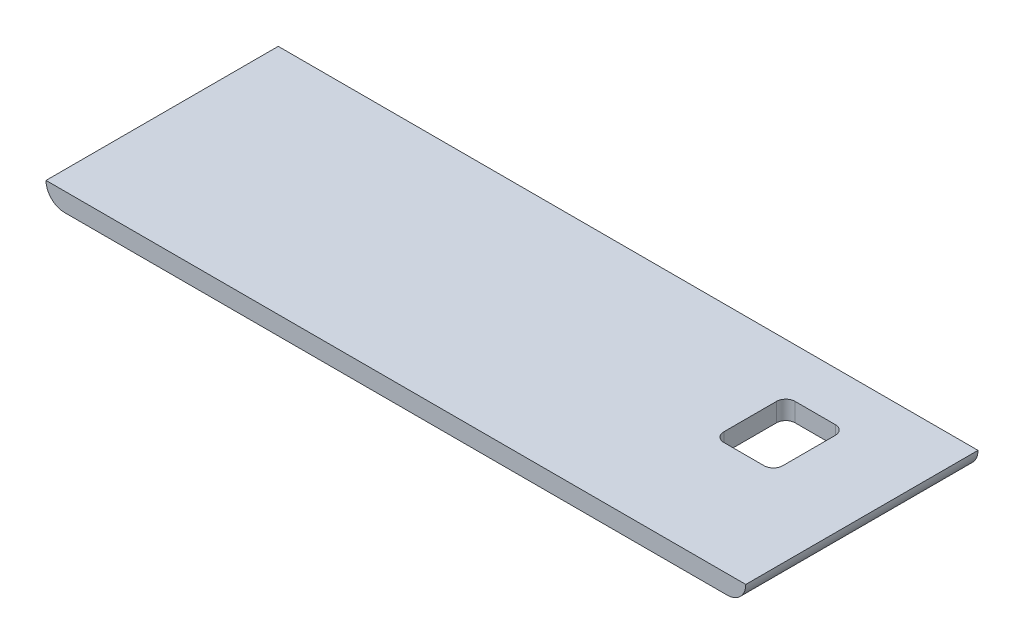
ISO-10303-21;
HEADER;
FILE_DESCRIPTION(('STEP AP214'),'2;1');
FILE_NAME('part.step','',(''),(''),'','','');
FILE_SCHEMA(('AUTOMOTIVE_DESIGN { 1 0 10303 214 1 1 1 1 }'));
ENDSEC;
DATA;
#1=APPLICATION_CONTEXT('core data for automotive mechanical design processes');
#2=APPLICATION_PROTOCOL_DEFINITION('international standard','automotive_design',2000,#1);
#3=PRODUCT_CONTEXT('',#1,'mechanical');
#4=PRODUCT('Part','Part','',(#3));
#5=PRODUCT_RELATED_PRODUCT_CATEGORY('part','',(#4));
#6=PRODUCT_DEFINITION_FORMATION('','',#4);
#7=PRODUCT_DEFINITION_CONTEXT('part definition',#1,'design');
#8=PRODUCT_DEFINITION('design','',#6,#7);
#9=PRODUCT_DEFINITION_SHAPE('','',#8);
#10=(LENGTH_UNIT() NAMED_UNIT(*) SI_UNIT(.MILLI.,.METRE.));
#11=(NAMED_UNIT(*) PLANE_ANGLE_UNIT() SI_UNIT($,.RADIAN.));
#12=(NAMED_UNIT(*) SI_UNIT($,.STERADIAN.) SOLID_ANGLE_UNIT());
#13=UNCERTAINTY_MEASURE_WITH_UNIT(LENGTH_MEASURE(1.E-05),#10,'distance_accuracy_value','');
#14=(GEOMETRIC_REPRESENTATION_CONTEXT(3) GLOBAL_UNCERTAINTY_ASSIGNED_CONTEXT((#13)) GLOBAL_UNIT_ASSIGNED_CONTEXT((#10,
#11,#12)) REPRESENTATION_CONTEXT('',''));
#15=CARTESIAN_POINT('',(0.,0.,0.));
#16=DIRECTION('',(0.,0.,1.));
#17=DIRECTION('',(1.,0.,0.));
#18=AXIS2_PLACEMENT_3D('',#15,#16,#17);
#19=CARTESIAN_POINT('',(115.,5.,1.5));
#20=DIRECTION('',(0.,-1.,0.));
#21=DIRECTION('',(0.,0.,-1.));
#22=AXIS2_PLACEMENT_3D('',#19,#20,#21);
#23=PLANE('',#22);
#24=DIRECTION('',(-1.,0.,0.));
#25=VECTOR('',#24,1.);
#26=CARTESIAN_POINT('',(103.4415158923,5.,9.421121748422));
#27=LINE('',#26,#25);
#28=CARTESIAN_POINT('',(99.883031784609,5.,9.421121748422));
#29=VERTEX_POINT('',#28);
#30=CARTESIAN_POINT('',(93.383031784609,5.,9.421121748422));
#31=VERTEX_POINT('',#30);
#32=EDGE_CURVE('E264',#29,#31,#27,.T.);
#33=ORIENTED_EDGE('',*,*,#32,.F.);
#34=CARTESIAN_POINT('',(99.883031784609,5.,10.921121748422));
#35=DIRECTION('',(0.,1.,0.));
#36=DIRECTION('',(1.,0.,0.));
#37=AXIS2_PLACEMENT_3D('',#34,#35,#36);
#38=CIRCLE('',#37,1.5);
#39=CARTESIAN_POINT('',(101.3830317846,5.,10.921121748422));
#40=VERTEX_POINT('',#39);
#41=EDGE_CURVE('E209',#40,#29,#38,.T.);
#42=ORIENTED_EDGE('',*,*,#41,.F.);
#43=DIRECTION('',(0.,0.,1.));
#44=VECTOR('',#43,1.);
#45=CARTESIAN_POINT('',(101.3830317846,5.,5.460560874211));
#46=LINE('',#45,#44);
#47=CARTESIAN_POINT('',(101.3830317846,5.,19.421121748422));
#48=VERTEX_POINT('',#47);
#49=EDGE_CURVE('E210',#40,#48,#46,.T.);
#50=ORIENTED_EDGE('',*,*,#49,.T.);
#51=CARTESIAN_POINT('',(99.883031784609,5.,19.421121748422));
#52=DIRECTION('',(0.,1.,0.));
#53=DIRECTION('',(1.,0.,0.));
#54=AXIS2_PLACEMENT_3D('',#51,#52,#53);
#55=CIRCLE('',#54,1.5);
#56=CARTESIAN_POINT('',(99.883031784609,5.,20.921121748422));
#57=VERTEX_POINT('',#56);
#58=EDGE_CURVE('E252',#57,#48,#55,.T.);
#59=ORIENTED_EDGE('',*,*,#58,.F.);
#60=DIRECTION('',(-1.,0.,0.));
#61=VECTOR('',#60,1.);
#62=CARTESIAN_POINT('',(103.4415158923,5.,20.921121748422));
#63=LINE('',#62,#61);
#64=CARTESIAN_POINT('',(93.383031784609,5.,20.921121748422));
#65=VERTEX_POINT('',#64);
#66=EDGE_CURVE('E245',#57,#65,#63,.T.);
#67=ORIENTED_EDGE('',*,*,#66,.T.);
#68=CARTESIAN_POINT('',(93.383031784609,5.,19.421121748422));
#69=DIRECTION('',(0.,1.,0.));
#70=DIRECTION('',(-1.,0.,0.));
#71=AXIS2_PLACEMENT_3D('',#68,#69,#70);
#72=CIRCLE('',#71,1.5);
#73=CARTESIAN_POINT('',(91.883031784609,5.,19.421121748422));
#74=VERTEX_POINT('',#73);
#75=EDGE_CURVE('E223',#74,#65,#72,.T.);
#76=ORIENTED_EDGE('',*,*,#75,.F.);
#77=DIRECTION('',(0.,0.,1.));
#78=VECTOR('',#77,1.);
#79=CARTESIAN_POINT('',(91.883031784609,5.,5.460560874211));
#80=LINE('',#79,#78);
#81=CARTESIAN_POINT('',(91.883031784609,5.,10.921121748422));
#82=VERTEX_POINT('',#81);
#83=EDGE_CURVE('E9',#82,#74,#80,.T.);
#84=ORIENTED_EDGE('',*,*,#83,.F.);
#85=CARTESIAN_POINT('',(93.383031784609,5.,10.921121748422));
#86=DIRECTION('',(0.,1.,0.));
#87=DIRECTION('',(-1.,0.,0.));
#88=AXIS2_PLACEMENT_3D('',#85,#86,#87);
#89=CIRCLE('',#88,1.5);
#90=EDGE_CURVE('E25',#31,#82,#89,.T.);
#91=ORIENTED_EDGE('',*,*,#90,.F.);
#92=EDGE_LOOP('',(#33,#42,#50,#59,#67,#76,#84,#91));
#93=FACE_BOUND('',#92,.T.);
#94=DIRECTION('',(-1.,0.,0.));
#95=VECTOR('',#94,1.);
#96=CARTESIAN_POINT('',(115.,5.,1.5));
#97=LINE('',#96,#95);
#98=CARTESIAN_POINT('',(115.,5.,1.5));
#99=VERTEX_POINT('',#98);
#100=CARTESIAN_POINT('',(2.,5.,1.5));
#101=VERTEX_POINT('',#100);
#102=EDGE_CURVE('E185',#99,#101,#97,.T.);
#103=ORIENTED_EDGE('',*,*,#102,.T.);
#104=DIRECTION('',(0.,0.,1.));
#105=VECTOR('',#104,1.);
#106=CARTESIAN_POINT('',(2.,5.,1.5));
#107=LINE('',#106,#105);
#108=CARTESIAN_POINT('',(2.,5.,39.));
#109=VERTEX_POINT('',#108);
#110=EDGE_CURVE('E140',#101,#109,#107,.T.);
#111=ORIENTED_EDGE('',*,*,#110,.T.);
#112=DIRECTION('',(-1.,0.,0.));
#113=VECTOR('',#112,1.);
#114=CARTESIAN_POINT('',(115.,5.,39.));
#115=LINE('',#114,#113);
#116=CARTESIAN_POINT('',(115.,5.,39.));
#117=VERTEX_POINT('',#116);
#118=EDGE_CURVE('E217',#117,#109,#115,.T.);
#119=ORIENTED_EDGE('',*,*,#118,.F.);
#120=DIRECTION('',(0.,0.,1.));
#121=VECTOR('',#120,1.);
#122=CARTESIAN_POINT('',(115.,5.,1.5));
#123=LINE('',#122,#121);
#124=EDGE_CURVE('E220',#99,#117,#123,.T.);
#125=ORIENTED_EDGE('',*,*,#124,.F.);
#126=EDGE_LOOP('',(#103,#111,#119,#125));
#127=FACE_BOUND('',#126,.T.);
#128=ADVANCED_FACE('F15',(#93,#127),#23,.F.);
#129=CARTESIAN_POINT('',(91.883031784609,1.,9.421121748422));
#130=DIRECTION('',(1.,0.,0.));
#131=DIRECTION('',(0.,1.,0.));
#132=AXIS2_PLACEMENT_3D('',#129,#130,#131);
#133=PLANE('',#132);
#134=DIRECTION('',(0.,0.,-1.));
#135=VECTOR('',#134,1.);
#136=CARTESIAN_POINT('',(91.883031784609,2.,5.460560874211));
#137=LINE('',#136,#135);
#138=CARTESIAN_POINT('',(91.883031784609,2.,19.421121748422));
#139=VERTEX_POINT('',#138);
#140=CARTESIAN_POINT('',(91.883031784609,2.,10.921121748422));
#141=VERTEX_POINT('',#140);
#142=EDGE_CURVE('E197',#139,#141,#137,.T.);
#143=ORIENTED_EDGE('',*,*,#142,.T.);
#144=DIRECTION('',(0.,1.,0.));
#145=VECTOR('',#144,1.);
#146=CARTESIAN_POINT('',(91.883031784609,1.,10.921121748422));
#147=LINE('',#146,#145);
#148=EDGE_CURVE('E230',#141,#82,#147,.T.);
#149=ORIENTED_EDGE('',*,*,#148,.T.);
#150=ORIENTED_EDGE('',*,*,#83,.T.);
#151=DIRECTION('',(0.,1.,0.));
#152=VECTOR('',#151,1.);
#153=CARTESIAN_POINT('',(91.883031784609,1.,19.421121748422));
#154=LINE('',#153,#152);
#155=EDGE_CURVE('E234',#139,#74,#154,.T.);
#156=ORIENTED_EDGE('',*,*,#155,.F.);
#157=EDGE_LOOP('',(#143,#149,#150,#156));
#158=FACE_BOUND('',#157,.T.);
#159=ADVANCED_FACE('F17',(#158),#133,.T.);
#160=CARTESIAN_POINT('',(93.383031784609,1.,10.921121748422));
#161=DIRECTION('',(0.,1.,0.));
#162=DIRECTION('',(-1.,0.,0.));
#163=AXIS2_PLACEMENT_3D('',#160,#161,#162);
#164=CYLINDRICAL_SURFACE('',#163,1.5);
#165=ORIENTED_EDGE('',*,*,#148,.F.);
#166=CARTESIAN_POINT('',(93.383031784609,2.,10.921121748422));
#167=DIRECTION('',(0.,1.,0.));
#168=DIRECTION('',(-1.,0.,0.));
#169=AXIS2_PLACEMENT_3D('',#166,#167,#168);
#170=CIRCLE('',#169,1.5);
#171=CARTESIAN_POINT('',(93.383031784609,2.,9.421121748422));
#172=VERTEX_POINT('',#171);
#173=EDGE_CURVE('E193',#172,#141,#170,.T.);
#174=ORIENTED_EDGE('',*,*,#173,.F.);
#175=DIRECTION('',(0.,1.,0.));
#176=VECTOR('',#175,1.);
#177=CARTESIAN_POINT('',(93.383031784609,1.,9.421121748422));
#178=LINE('',#177,#176);
#179=EDGE_CURVE('E19',#172,#31,#178,.T.);
#180=ORIENTED_EDGE('',*,*,#179,.T.);
#181=ORIENTED_EDGE('',*,*,#90,.T.);
#182=EDGE_LOOP('',(#165,#174,#180,#181));
#183=FACE_BOUND('',#182,.T.);
#184=ADVANCED_FACE('F274',(#183),#164,.F.);
#185=CARTESIAN_POINT('',(91.883031784609,1.,9.421121748422));
#186=DIRECTION('',(0.,0.,1.));
#187=DIRECTION('',(1.,0.,0.));
#188=AXIS2_PLACEMENT_3D('',#185,#186,#187);
#189=PLANE('',#188);
#190=ORIENTED_EDGE('',*,*,#32,.T.);
#191=ORIENTED_EDGE('',*,*,#179,.F.);
#192=DIRECTION('',(1.,0.,0.));
#193=VECTOR('',#192,1.);
#194=CARTESIAN_POINT('',(48.441515892304,2.,9.421121748422));
#195=LINE('',#194,#193);
#196=CARTESIAN_POINT('',(99.883031784609,2.,9.421121748422));
#197=VERTEX_POINT('',#196);
#198=EDGE_CURVE('E189',#172,#197,#195,.T.);
#199=ORIENTED_EDGE('',*,*,#198,.T.);
#200=DIRECTION('',(0.,1.,0.));
#201=VECTOR('',#200,1.);
#202=CARTESIAN_POINT('',(99.883031784609,1.,9.421121748422));
#203=LINE('',#202,#201);
#204=EDGE_CURVE('E261',#197,#29,#203,.T.);
#205=ORIENTED_EDGE('',*,*,#204,.T.);
#206=EDGE_LOOP('',(#190,#191,#199,#205));
#207=FACE_BOUND('',#206,.T.);
#208=ADVANCED_FACE('F276',(#207),#189,.T.);
#209=CARTESIAN_POINT('',(99.883031784609,1.,10.921121748422));
#210=DIRECTION('',(0.,1.,0.));
#211=DIRECTION('',(1.,0.,0.));
#212=AXIS2_PLACEMENT_3D('',#209,#210,#211);
#213=CYLINDRICAL_SURFACE('',#212,1.5);
#214=ORIENTED_EDGE('',*,*,#41,.T.);
#215=ORIENTED_EDGE('',*,*,#204,.F.);
#216=CARTESIAN_POINT('',(99.883031784609,2.,10.921121748422));
#217=DIRECTION('',(0.,1.,0.));
#218=DIRECTION('',(1.,0.,0.));
#219=AXIS2_PLACEMENT_3D('',#216,#217,#218);
#220=CIRCLE('',#219,1.5);
#221=CARTESIAN_POINT('',(101.3830317846,2.,10.921121748422));
#222=VERTEX_POINT('',#221);
#223=EDGE_CURVE('E182',#222,#197,#220,.T.);
#224=ORIENTED_EDGE('',*,*,#223,.F.);
#225=DIRECTION('',(0.,1.,0.));
#226=VECTOR('',#225,1.);
#227=CARTESIAN_POINT('',(101.3830317846,1.,10.921121748422));
#228=LINE('',#227,#226);
#229=EDGE_CURVE('E205',#222,#40,#228,.T.);
#230=ORIENTED_EDGE('',*,*,#229,.T.);
#231=EDGE_LOOP('',(#214,#215,#224,#230));
#232=FACE_BOUND('',#231,.T.);
#233=ADVANCED_FACE('F282',(#232),#213,.F.);
#234=CARTESIAN_POINT('',(101.3830317846,1.,9.421121748422));
#235=DIRECTION('',(1.,0.,0.));
#236=DIRECTION('',(0.,1.,0.));
#237=AXIS2_PLACEMENT_3D('',#234,#235,#236);
#238=PLANE('',#237);
#239=DIRECTION('',(0.,1.,0.));
#240=VECTOR('',#239,1.);
#241=CARTESIAN_POINT('',(101.3830317846,1.,19.421121748422));
#242=LINE('',#241,#240);
#243=CARTESIAN_POINT('',(101.3830317846,2.,19.421121748422));
#244=VERTEX_POINT('',#243);
#245=EDGE_CURVE('E248',#244,#48,#242,.T.);
#246=ORIENTED_EDGE('',*,*,#245,.T.);
#247=ORIENTED_EDGE('',*,*,#49,.F.);
#248=ORIENTED_EDGE('',*,*,#229,.F.);
#249=DIRECTION('',(0.,0.,-1.));
#250=VECTOR('',#249,1.);
#251=CARTESIAN_POINT('',(101.3830317846,2.,5.460560874211));
#252=LINE('',#251,#250);
#253=EDGE_CURVE('E176',#244,#222,#252,.T.);
#254=ORIENTED_EDGE('',*,*,#253,.F.);
#255=EDGE_LOOP('',(#246,#247,#248,#254));
#256=FACE_BOUND('',#255,.T.);
#257=ADVANCED_FACE('F290',(#256),#238,.F.);
#258=CARTESIAN_POINT('',(99.883031784609,1.,19.421121748422));
#259=DIRECTION('',(0.,1.,0.));
#260=DIRECTION('',(1.,0.,0.));
#261=AXIS2_PLACEMENT_3D('',#258,#259,#260);
#262=CYLINDRICAL_SURFACE('',#261,1.5);
#263=ORIENTED_EDGE('',*,*,#245,.F.);
#264=CARTESIAN_POINT('',(99.883031784609,2.,19.421121748422));
#265=DIRECTION('',(0.,1.,0.));
#266=DIRECTION('',(1.,0.,0.));
#267=AXIS2_PLACEMENT_3D('',#264,#265,#266);
#268=CIRCLE('',#267,1.5);
#269=CARTESIAN_POINT('',(99.883031784609,2.,20.921121748422));
#270=VERTEX_POINT('',#269);
#271=EDGE_CURVE('E172',#270,#244,#268,.T.);
#272=ORIENTED_EDGE('',*,*,#271,.F.);
#273=DIRECTION('',(0.,1.,0.));
#274=VECTOR('',#273,1.);
#275=CARTESIAN_POINT('',(99.883031784609,1.,20.921121748422));
#276=LINE('',#275,#274);
#277=EDGE_CURVE('E238',#270,#57,#276,.T.);
#278=ORIENTED_EDGE('',*,*,#277,.T.);
#279=ORIENTED_EDGE('',*,*,#58,.T.);
#280=EDGE_LOOP('',(#263,#272,#278,#279));
#281=FACE_BOUND('',#280,.T.);
#282=ADVANCED_FACE('F288',(#281),#262,.F.);
#283=CARTESIAN_POINT('',(91.883031784609,1.,20.921121748422));
#284=DIRECTION('',(0.,0.,1.));
#285=DIRECTION('',(1.,0.,0.));
#286=AXIS2_PLACEMENT_3D('',#283,#284,#285);
#287=PLANE('',#286);
#288=ORIENTED_EDGE('',*,*,#277,.F.);
#289=DIRECTION('',(1.,0.,0.));
#290=VECTOR('',#289,1.);
#291=CARTESIAN_POINT('',(48.441515892304,2.,20.921121748422));
#292=LINE('',#291,#290);
#293=CARTESIAN_POINT('',(93.383031784609,2.,20.921121748422));
#294=VERTEX_POINT('',#293);
#295=EDGE_CURVE('E156',#294,#270,#292,.T.);
#296=ORIENTED_EDGE('',*,*,#295,.F.);
#297=DIRECTION('',(0.,1.,0.));
#298=VECTOR('',#297,1.);
#299=CARTESIAN_POINT('',(93.383031784609,1.,20.921121748422));
#300=LINE('',#299,#298);
#301=EDGE_CURVE('E227',#294,#65,#300,.T.);
#302=ORIENTED_EDGE('',*,*,#301,.T.);
#303=ORIENTED_EDGE('',*,*,#66,.F.);
#304=EDGE_LOOP('',(#288,#296,#302,#303));
#305=FACE_BOUND('',#304,.T.);
#306=ADVANCED_FACE('F301',(#305),#287,.F.);
#307=CARTESIAN_POINT('',(93.383031784609,1.,19.421121748422));
#308=DIRECTION('',(0.,1.,0.));
#309=DIRECTION('',(-1.,0.,0.));
#310=AXIS2_PLACEMENT_3D('',#307,#308,#309);
#311=CYLINDRICAL_SURFACE('',#310,1.5);
#312=ORIENTED_EDGE('',*,*,#75,.T.);
#313=ORIENTED_EDGE('',*,*,#301,.F.);
#314=CARTESIAN_POINT('',(93.383031784609,2.,19.421121748422));
#315=DIRECTION('',(0.,1.,0.));
#316=DIRECTION('',(-1.,0.,0.));
#317=AXIS2_PLACEMENT_3D('',#314,#315,#316);
#318=CIRCLE('',#317,1.5);
#319=EDGE_CURVE('E146',#139,#294,#318,.T.);
#320=ORIENTED_EDGE('',*,*,#319,.F.);
#321=ORIENTED_EDGE('',*,*,#155,.T.);
#322=EDGE_LOOP('',(#312,#313,#320,#321));
#323=FACE_BOUND('',#322,.T.);
#324=ADVANCED_FACE('F303',(#323),#311,.F.);
#325=CARTESIAN_POINT('',(112.,5.,1.5));
#326=DIRECTION('',(0.,0.,-1.));
#327=DIRECTION('',(0.,-1.,0.));
#328=AXIS2_PLACEMENT_3D('',#325,#326,#327);
#329=CYLINDRICAL_SURFACE('',#328,3.);
#330=CARTESIAN_POINT('',(112.,5.,1.5));
#331=DIRECTION('',(0.,0.,1.));
#332=DIRECTION('',(0.,-1.,0.));
#333=AXIS2_PLACEMENT_3D('',#330,#331,#332);
#334=CIRCLE('',#333,3.);
#335=CARTESIAN_POINT('',(112.,2.,1.5));
#336=VERTEX_POINT('',#335);
#337=EDGE_CURVE('E160',#336,#99,#334,.T.);
#338=ORIENTED_EDGE('',*,*,#337,.T.);
#339=ORIENTED_EDGE('',*,*,#124,.T.);
#340=CARTESIAN_POINT('',(112.,5.,39.));
#341=DIRECTION('',(0.,0.,1.));
#342=DIRECTION('',(0.,-1.,0.));
#343=AXIS2_PLACEMENT_3D('',#340,#341,#342);
#344=CIRCLE('',#343,3.);
#345=CARTESIAN_POINT('',(112.,2.,39.));
#346=VERTEX_POINT('',#345);
#347=EDGE_CURVE('E213',#346,#117,#344,.T.);
#348=ORIENTED_EDGE('',*,*,#347,.F.);
#349=DIRECTION('',(0.,0.,1.));
#350=VECTOR('',#349,1.);
#351=CARTESIAN_POINT('',(112.,2.,1.5));
#352=LINE('',#351,#350);
#353=EDGE_CURVE('E163',#336,#346,#352,.T.);
#354=ORIENTED_EDGE('',*,*,#353,.F.);
#355=EDGE_LOOP('',(#338,#339,#348,#354));
#356=FACE_BOUND('',#355,.T.);
#357=ADVANCED_FACE('F320',(#356),#329,.T.);
#358=CARTESIAN_POINT('',(58.5,3.524374781309,39.));
#359=DIRECTION('',(0.,0.,1.));
#360=DIRECTION('',(1.,0.,0.));
#361=AXIS2_PLACEMENT_3D('',#358,#359,#360);
#362=PLANE('',#361);
#363=DIRECTION('',(1.,0.,0.));
#364=VECTOR('',#363,1.);
#365=CARTESIAN_POINT('',(5.,2.,39.));
#366=LINE('',#365,#364);
#367=CARTESIAN_POINT('',(5.,2.,39.));
#368=VERTEX_POINT('',#367);
#369=EDGE_CURVE('E154',#368,#346,#366,.T.);
#370=ORIENTED_EDGE('',*,*,#369,.T.);
#371=ORIENTED_EDGE('',*,*,#347,.T.);
#372=ORIENTED_EDGE('',*,*,#118,.T.);
#373=CARTESIAN_POINT('',(5.,5.,39.));
#374=DIRECTION('',(0.,0.,1.));
#375=DIRECTION('',(-1.,0.,0.));
#376=AXIS2_PLACEMENT_3D('',#373,#374,#375);
#377=CIRCLE('',#376,3.);
#378=EDGE_CURVE('E145',#109,#368,#377,.T.);
#379=ORIENTED_EDGE('',*,*,#378,.T.);
#380=EDGE_LOOP('',(#370,#371,#372,#379));
#381=FACE_BOUND('',#380,.T.);
#382=ADVANCED_FACE('F316',(#381),#362,.T.);
#383=CARTESIAN_POINT('',(58.5,3.524374781309,1.5));
#384=DIRECTION('',(0.,0.,1.));
#385=DIRECTION('',(1.,0.,0.));
#386=AXIS2_PLACEMENT_3D('',#383,#384,#385);
#387=PLANE('',#386);
#388=CARTESIAN_POINT('',(5.,5.,1.5));
#389=DIRECTION('',(0.,0.,1.));
#390=DIRECTION('',(-1.,0.,0.));
#391=AXIS2_PLACEMENT_3D('',#388,#389,#390);
#392=CIRCLE('',#391,3.);
#393=CARTESIAN_POINT('',(5.,2.,1.5));
#394=VERTEX_POINT('',#393);
#395=EDGE_CURVE('E133',#101,#394,#392,.T.);
#396=ORIENTED_EDGE('',*,*,#395,.F.);
#397=ORIENTED_EDGE('',*,*,#102,.F.);
#398=ORIENTED_EDGE('',*,*,#337,.F.);
#399=DIRECTION('',(1.,0.,0.));
#400=VECTOR('',#399,1.);
#401=CARTESIAN_POINT('',(5.,2.,1.5));
#402=LINE('',#401,#400);
#403=EDGE_CURVE('E152',#394,#336,#402,.T.);
#404=ORIENTED_EDGE('',*,*,#403,.F.);
#405=EDGE_LOOP('',(#396,#397,#398,#404));
#406=FACE_BOUND('',#405,.T.);
#407=ADVANCED_FACE('F158',(#406),#387,.F.);
#408=CARTESIAN_POINT('',(5.,5.,1.5));
#409=DIRECTION('',(0.,0.,-1.));
#410=DIRECTION('',(-1.,0.,0.));
#411=AXIS2_PLACEMENT_3D('',#408,#409,#410);
#412=CYLINDRICAL_SURFACE('',#411,3.);
#413=ORIENTED_EDGE('',*,*,#395,.T.);
#414=DIRECTION('',(0.,0.,1.));
#415=VECTOR('',#414,1.);
#416=CARTESIAN_POINT('',(5.,2.,1.5));
#417=LINE('',#416,#415);
#418=EDGE_CURVE('E137',#394,#368,#417,.T.);
#419=ORIENTED_EDGE('',*,*,#418,.T.);
#420=ORIENTED_EDGE('',*,*,#378,.F.);
#421=ORIENTED_EDGE('',*,*,#110,.F.);
#422=EDGE_LOOP('',(#413,#419,#420,#421));
#423=FACE_BOUND('',#422,.T.);
#424=ADVANCED_FACE('F135',(#423),#412,.T.);
#425=CARTESIAN_POINT('',(5.,2.,1.5));
#426=DIRECTION('',(0.,1.,0.));
#427=DIRECTION('',(1.,0.,0.));
#428=AXIS2_PLACEMENT_3D('',#425,#426,#427);
#429=PLANE('',#428);
#430=ORIENTED_EDGE('',*,*,#295,.T.);
#431=ORIENTED_EDGE('',*,*,#271,.T.);
#432=ORIENTED_EDGE('',*,*,#253,.T.);
#433=ORIENTED_EDGE('',*,*,#223,.T.);
#434=ORIENTED_EDGE('',*,*,#198,.F.);
#435=ORIENTED_EDGE('',*,*,#173,.T.);
#436=ORIENTED_EDGE('',*,*,#142,.F.);
#437=ORIENTED_EDGE('',*,*,#319,.T.);
#438=EDGE_LOOP('',(#430,#431,#432,#433,#434,#435,#436,#437));
#439=FACE_BOUND('',#438,.T.);
#440=ORIENTED_EDGE('',*,*,#403,.T.);
#441=ORIENTED_EDGE('',*,*,#353,.T.);
#442=ORIENTED_EDGE('',*,*,#369,.F.);
#443=ORIENTED_EDGE('',*,*,#418,.F.);
#444=EDGE_LOOP('',(#440,#441,#442,#443));
#445=FACE_BOUND('',#444,.T.);
#446=ADVANCED_FACE('F150',(#439,#445),#429,.F.);
#447=CLOSED_SHELL('',(#128,#159,#184,#208,#233,#257,#282,#306,#324,#357,#382,#407,#424,#446));
#448=MANIFOLD_SOLID_BREP('B1',#447);
#449=ADVANCED_BREP_SHAPE_REPRESENTATION('',(#18,#448),#14);
#450=SHAPE_DEFINITION_REPRESENTATION(#9,#449);
ENDSEC;
END-ISO-10303-21;
